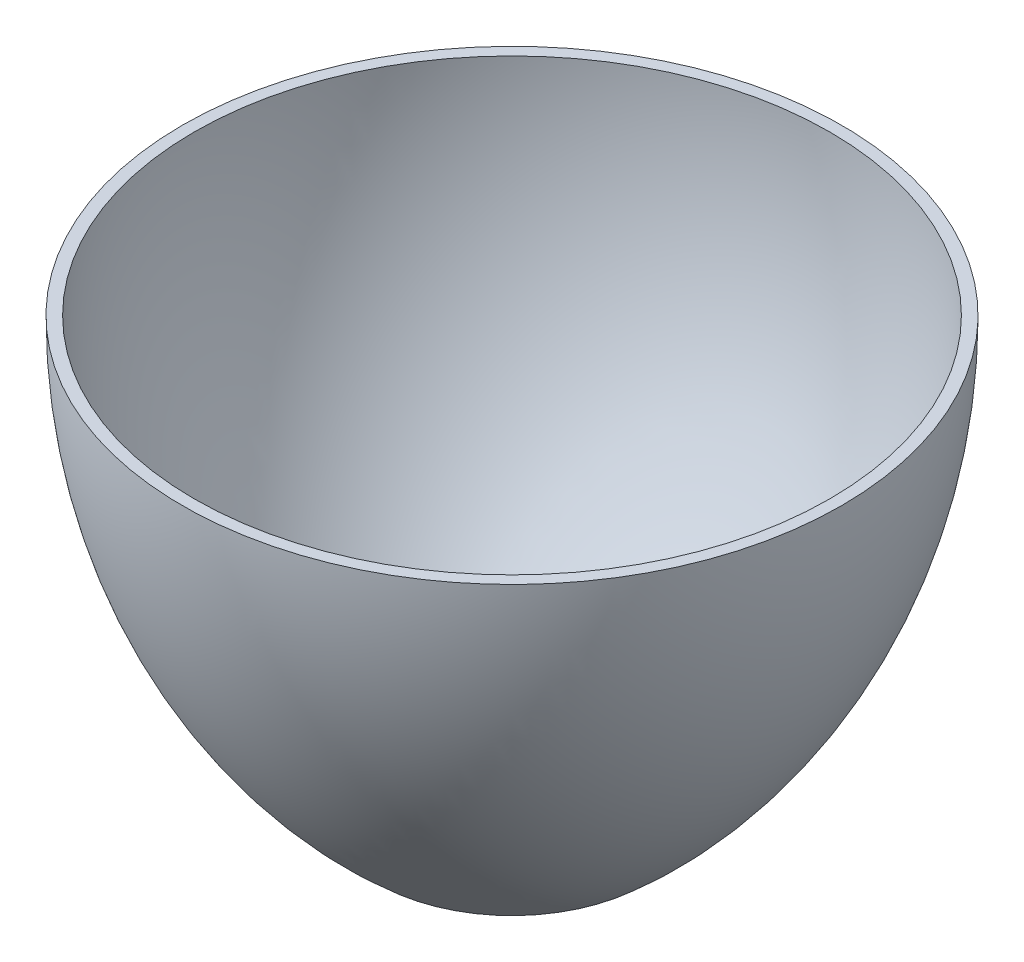
ISO-10303-21;
HEADER;
FILE_DESCRIPTION(('STEP AP214'),'2;1');
FILE_NAME('part.step','',(''),(''),'','','');
FILE_SCHEMA(('AUTOMOTIVE_DESIGN { 1 0 10303 214 1 1 1 1 }'));
ENDSEC;
DATA;
#1=APPLICATION_CONTEXT('core data for automotive mechanical design processes');
#2=APPLICATION_PROTOCOL_DEFINITION('international standard','automotive_design',2000,#1);
#3=PRODUCT_CONTEXT('',#1,'mechanical');
#4=PRODUCT('Part','Part','',(#3));
#5=PRODUCT_RELATED_PRODUCT_CATEGORY('part','',(#4));
#6=PRODUCT_DEFINITION_FORMATION('','',#4);
#7=PRODUCT_DEFINITION_CONTEXT('part definition',#1,'design');
#8=PRODUCT_DEFINITION('design','',#6,#7);
#9=PRODUCT_DEFINITION_SHAPE('','',#8);
#10=(LENGTH_UNIT() NAMED_UNIT(*) SI_UNIT(.MILLI.,.METRE.));
#11=(NAMED_UNIT(*) PLANE_ANGLE_UNIT() SI_UNIT($,.RADIAN.));
#12=(NAMED_UNIT(*) SI_UNIT($,.STERADIAN.) SOLID_ANGLE_UNIT());
#13=UNCERTAINTY_MEASURE_WITH_UNIT(LENGTH_MEASURE(1.E-05),#10,'distance_accuracy_value','');
#14=(GEOMETRIC_REPRESENTATION_CONTEXT(3) GLOBAL_UNCERTAINTY_ASSIGNED_CONTEXT((#13)) GLOBAL_UNIT_ASSIGNED_CONTEXT((#10,
#11,#12)) REPRESENTATION_CONTEXT('',''));
#15=CARTESIAN_POINT('',(0.,0.,0.));
#16=DIRECTION('',(0.,0.,1.));
#17=DIRECTION('',(1.,0.,0.));
#18=AXIS2_PLACEMENT_3D('',#15,#16,#17);
#19=CARTESIAN_POINT('',(0.,0.,0.));
#20=DIRECTION('',(0.,1.,0.));
#21=DIRECTION('',(-1.,0.,0.));
#22=AXIS2_PLACEMENT_3D('',#19,#20,#21);
#23=DEGENERATE_TOROIDAL_SURFACE('',#22,62.2860294117647,151.186029411765,.F.);
#24=CARTESIAN_POINT('',(0.,-114.3,0.));
#25=DIRECTION('',(0.,1.,0.));
#26=DIRECTION('',(-1.,0.,0.));
#27=AXIS2_PLACEMENT_3D('',#24,#25,#26);
#28=CIRCLE('',#27,36.6721713059878);
#29=CARTESIAN_POINT('',(-36.6721713059877,-114.3,0.));
#30=VERTEX_POINT('',#29);
#31=EDGE_CURVE('E45',#30,#30,#28,.T.);
#32=ORIENTED_EDGE('',*,*,#31,.T.);
#33=EDGE_LOOP('',(#32));
#34=FACE_BOUND('',#33,.T.);
#35=CARTESIAN_POINT('',(0.,0.,0.));
#36=DIRECTION('',(0.,1.,0.));
#37=DIRECTION('',(-1.,0.,0.));
#38=AXIS2_PLACEMENT_3D('',#35,#36,#37);
#39=CIRCLE('',#38,88.9);
#40=CARTESIAN_POINT('',(-88.9,0.,0.));
#41=VERTEX_POINT('',#40);
#42=EDGE_CURVE('E10',#41,#41,#39,.T.);
#43=ORIENTED_EDGE('',*,*,#42,.F.);
#44=EDGE_LOOP('',(#43));
#45=FACE_BOUND('',#44,.T.);
#46=ADVANCED_FACE('F39',(#34,#45),#23,.F.);
#47=CARTESIAN_POINT('',(0.,0.,0.));
#48=DIRECTION('',(0.,1.,0.));
#49=DIRECTION('',(-1.,0.,0.));
#50=AXIS2_PLACEMENT_3D('',#47,#48,#49);
#51=PLANE('',#50);
#52=CARTESIAN_POINT('',(0.,0.,0.));
#53=DIRECTION('',(0.,1.,0.));
#54=DIRECTION('',(-1.,0.,0.));
#55=AXIS2_PLACEMENT_3D('',#52,#53,#54);
#56=CIRCLE('',#55,85.725);
#57=CARTESIAN_POINT('',(-85.725,0.,0.));
#58=VERTEX_POINT('',#57);
#59=EDGE_CURVE('E49',#58,#58,#56,.T.);
#60=ORIENTED_EDGE('',*,*,#59,.F.);
#61=EDGE_LOOP('',(#60));
#62=FACE_BOUND('',#61,.T.);
#63=ORIENTED_EDGE('',*,*,#42,.T.);
#64=EDGE_LOOP('',(#63));
#65=FACE_BOUND('',#64,.T.);
#66=ADVANCED_FACE('F68',(#62,#65),#51,.T.);
#67=CARTESIAN_POINT('',(0.,-114.3,0.));
#68=DIRECTION('',(0.,1.,0.));
#69=DIRECTION('',(-1.,0.,0.));
#70=AXIS2_PLACEMENT_3D('',#67,#68,#69);
#71=PLANE('',#70);
#72=CARTESIAN_POINT('',(0.,-114.3,0.));
#73=DIRECTION('',(0.,1.,0.));
#74=DIRECTION('',(-1.,0.,0.));
#75=AXIS2_PLACEMENT_3D('',#72,#73,#74);
#76=CIRCLE('',#75,31.75);
#77=CARTESIAN_POINT('',(-31.75,-114.3,0.));
#78=VERTEX_POINT('',#77);
#79=EDGE_CURVE('E53',#78,#78,#76,.T.);
#80=ORIENTED_EDGE('',*,*,#79,.T.);
#81=EDGE_LOOP('',(#80));
#82=FACE_BOUND('',#81,.T.);
#83=ORIENTED_EDGE('',*,*,#31,.F.);
#84=EDGE_LOOP('',(#83));
#85=FACE_BOUND('',#84,.T.);
#86=ADVANCED_FACE('F59',(#82,#85),#71,.F.);
#87=CARTESIAN_POINT('',(0.,0.,0.));
#88=DIRECTION('',(0.,1.,0.));
#89=DIRECTION('',(-1.,0.,0.));
#90=AXIS2_PLACEMENT_3D('',#87,#88,#89);
#91=DEGENERATE_TOROIDAL_SURFACE('',#90,62.2860294117647,148.011029411765,.F.);
#92=ORIENTED_EDGE('',*,*,#79,.F.);
#93=EDGE_LOOP('',(#92));
#94=FACE_BOUND('',#93,.T.);
#95=ORIENTED_EDGE('',*,*,#59,.T.);
#96=EDGE_LOOP('',(#95));
#97=FACE_BOUND('',#96,.T.);
#98=ADVANCED_FACE('F62',(#94,#97),#91,.T.);
#99=CLOSED_SHELL('',(#46,#66,#86,#98));
#100=MANIFOLD_SOLID_BREP('B2',#99);
#101=ADVANCED_BREP_SHAPE_REPRESENTATION('',(#18,#100),#14);
#102=SHAPE_DEFINITION_REPRESENTATION(#9,#101);
ENDSEC;
END-ISO-10303-21;
